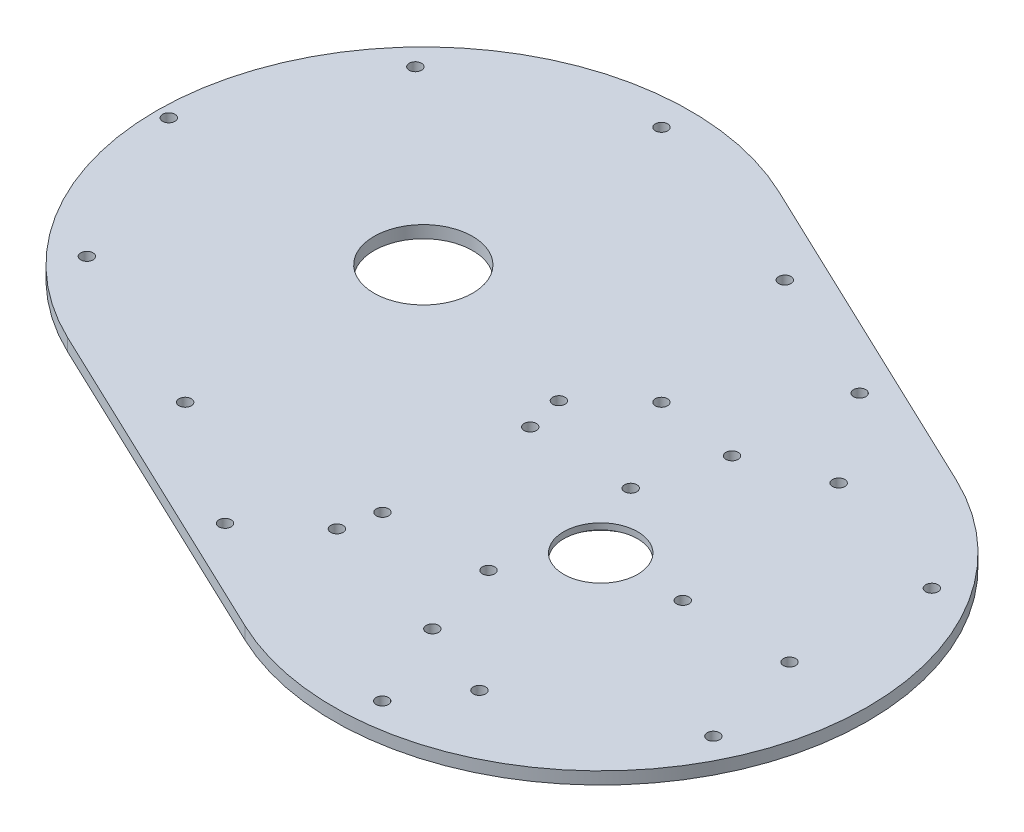
ISO-10303-21;
HEADER;
FILE_DESCRIPTION(('STEP AP214'),'2;1');
FILE_NAME('part.step','',(''),(''),'','','');
FILE_SCHEMA(('AUTOMOTIVE_DESIGN { 1 0 10303 214 1 1 1 1 }'));
ENDSEC;
DATA;
#1=APPLICATION_CONTEXT('core data for automotive mechanical design processes');
#2=APPLICATION_PROTOCOL_DEFINITION('international standard','automotive_design',2000,#1);
#3=PRODUCT_CONTEXT('',#1,'mechanical');
#4=PRODUCT('Part','Part','',(#3));
#5=PRODUCT_RELATED_PRODUCT_CATEGORY('part','',(#4));
#6=PRODUCT_DEFINITION_FORMATION('','',#4);
#7=PRODUCT_DEFINITION_CONTEXT('part definition',#1,'design');
#8=PRODUCT_DEFINITION('design','',#6,#7);
#9=PRODUCT_DEFINITION_SHAPE('','',#8);
#10=(LENGTH_UNIT() NAMED_UNIT(*) SI_UNIT(.MILLI.,.METRE.));
#11=(NAMED_UNIT(*) PLANE_ANGLE_UNIT() SI_UNIT($,.RADIAN.));
#12=(NAMED_UNIT(*) SI_UNIT($,.STERADIAN.) SOLID_ANGLE_UNIT());
#13=UNCERTAINTY_MEASURE_WITH_UNIT(LENGTH_MEASURE(1.E-05),#10,'distance_accuracy_value','');
#14=(GEOMETRIC_REPRESENTATION_CONTEXT(3) GLOBAL_UNCERTAINTY_ASSIGNED_CONTEXT((#13)) GLOBAL_UNIT_ASSIGNED_CONTEXT((#10,
#11,#12)) REPRESENTATION_CONTEXT('',''));
#15=CARTESIAN_POINT('',(0.,0.,0.));
#16=DIRECTION('',(0.,0.,1.));
#17=DIRECTION('',(1.,0.,0.));
#18=AXIS2_PLACEMENT_3D('',#15,#16,#17);
#19=CARTESIAN_POINT('',(41.2,3.,0.));
#20=DIRECTION('',(0.,-1.,0.));
#21=DIRECTION('',(0.,0.,-1.));
#22=AXIS2_PLACEMENT_3D('',#19,#20,#21);
#23=CYLINDRICAL_SURFACE('',#22,9.);
#24=CARTESIAN_POINT('',(41.2,3.,0.));
#25=DIRECTION('',(0.,1.,0.));
#26=DIRECTION('',(0.,0.,1.));
#27=AXIS2_PLACEMENT_3D('',#24,#25,#26);
#28=CIRCLE('',#27,9.);
#29=CARTESIAN_POINT('',(41.2,3.,8.99999999999999));
#30=VERTEX_POINT('',#29);
#31=EDGE_CURVE('E106',#30,#30,#28,.T.);
#32=ORIENTED_EDGE('',*,*,#31,.T.);
#33=EDGE_LOOP('',(#32));
#34=FACE_BOUND('',#33,.T.);
#35=CARTESIAN_POINT('',(41.2,1.5,0.));
#36=DIRECTION('',(0.,-1.,0.));
#37=DIRECTION('',(1.,0.,0.));
#38=AXIS2_PLACEMENT_3D('',#35,#36,#37);
#39=CIRCLE('',#38,9.);
#40=CARTESIAN_POINT('',(50.2,1.5,0.));
#41=VERTEX_POINT('',#40);
#42=EDGE_CURVE('E631',#41,#41,#39,.T.);
#43=ORIENTED_EDGE('',*,*,#42,.T.);
#44=EDGE_LOOP('',(#43));
#45=FACE_BOUND('',#44,.T.);
#46=ADVANCED_FACE('F40',(#34,#45),#23,.F.);
#47=CARTESIAN_POINT('',(0.,3.,0.));
#48=DIRECTION('',(0.,1.,0.));
#49=DIRECTION('',(0.,0.,1.));
#50=AXIS2_PLACEMENT_3D('',#47,#48,#49);
#51=PLANE('',#50);
#52=CARTESIAN_POINT('',(45.8095496501731,3.,57.818289078998));
#53=DIRECTION('',(0.,1.,0.));
#54=DIRECTION('',(0.,0.,1.));
#55=AXIS2_PLACEMENT_3D('',#52,#53,#54);
#56=CIRCLE('',#55,1.50000000000003);
#57=CARTESIAN_POINT('',(45.8095496501731,3.,59.318289078998));
#58=VERTEX_POINT('',#57);
#59=EDGE_CURVE('E262',#58,#58,#56,.F.);
#60=ORIENTED_EDGE('',*,*,#59,.T.);
#61=EDGE_LOOP('',(#60));
#62=FACE_BOUND('',#61,.T.);
#63=CARTESIAN_POINT('',(93.5768819708512,3.,24.9171574424437));
#64=DIRECTION('',(0.,1.,0.));
#65=DIRECTION('',(0.,0.,1.));
#66=AXIS2_PLACEMENT_3D('',#63,#64,#65);
#67=CIRCLE('',#66,1.5);
#68=CARTESIAN_POINT('',(93.5768819708512,3.,26.4171574424437));
#69=VERTEX_POINT('',#68);
#70=EDGE_CURVE('E268',#69,#69,#67,.T.);
#71=ORIENTED_EDGE('',*,*,#70,.F.);
#72=EDGE_LOOP('',(#71));
#73=FACE_BOUND('',#72,.T.);
#74=CARTESIAN_POINT('',(88.9673323206785,3.,-32.9011316365542));
#75=DIRECTION('',(0.,1.,0.));
#76=DIRECTION('',(0.,0.,1.));
#77=AXIS2_PLACEMENT_3D('',#74,#75,#76);
#78=CIRCLE('',#77,1.5);
#79=CARTESIAN_POINT('',(88.9673323206785,3.,-31.4011316365542));
#80=VERTEX_POINT('',#79);
#81=EDGE_CURVE('E274',#80,#80,#78,.T.);
#82=ORIENTED_EDGE('',*,*,#81,.F.);
#83=EDGE_LOOP('',(#82));
#84=FACE_BOUND('',#83,.T.);
#85=CARTESIAN_POINT('',(39.0264821333822,3.,-65.2646789625407));
#86=DIRECTION('',(0.,1.,0.));
#87=DIRECTION('',(0.,0.,1.));
#88=AXIS2_PLACEMENT_3D('',#85,#86,#87);
#89=CIRCLE('',#88,1.5);
#90=CARTESIAN_POINT('',(39.0264821333822,3.,-63.7646789625406));
#91=VERTEX_POINT('',#90);
#92=EDGE_CURVE('E280',#91,#91,#89,.T.);
#93=ORIENTED_EDGE('',*,*,#92,.F.);
#94=EDGE_LOOP('',(#93));
#95=FACE_BOUND('',#94,.T.);
#96=CARTESIAN_POINT('',(-103.2,3.,-39.2));
#97=DIRECTION('',(0.,1.,0.));
#98=DIRECTION('',(0.,0.,1.));
#99=AXIS2_PLACEMENT_3D('',#96,#97,#98);
#100=CIRCLE('',#99,1.5);
#101=CARTESIAN_POINT('',(-103.2,3.,-37.7));
#102=VERTEX_POINT('',#101);
#103=EDGE_CURVE('E211',#102,#102,#100,.T.);
#104=ORIENTED_EDGE('',*,*,#103,.F.);
#105=EDGE_LOOP('',(#104));
#106=FACE_BOUND('',#105,.T.);
#107=CARTESIAN_POINT('',(36.7,3.,-36.5));
#108=DIRECTION('',(0.,1.,0.));
#109=DIRECTION('',(0.,0.,1.));
#110=AXIS2_PLACEMENT_3D('',#107,#108,#109);
#111=CIRCLE('',#110,1.5);
#112=CARTESIAN_POINT('',(36.7,3.,-35.));
#113=VERTEX_POINT('',#112);
#114=EDGE_CURVE('E286',#113,#113,#111,.F.);
#115=ORIENTED_EDGE('',*,*,#114,.T.);
#116=EDGE_LOOP('',(#115));
#117=FACE_BOUND('',#116,.T.);
#118=CARTESIAN_POINT('',(36.7,3.,36.5));
#119=DIRECTION('',(0.,1.,0.));
#120=DIRECTION('',(0.,0.,1.));
#121=AXIS2_PLACEMENT_3D('',#118,#119,#120);
#122=CIRCLE('',#121,1.5);
#123=CARTESIAN_POINT('',(36.7,3.,38.));
#124=VERTEX_POINT('',#123);
#125=EDGE_CURVE('E289',#124,#124,#122,.T.);
#126=ORIENTED_EDGE('',*,*,#125,.F.);
#127=EDGE_LOOP('',(#126));
#128=FACE_BOUND('',#127,.T.);
#129=CARTESIAN_POINT('',(31.2,3.,-17.3205080756888));
#130=DIRECTION('',(0.,1.,0.));
#131=DIRECTION('',(0.,0.,1.));
#132=AXIS2_PLACEMENT_3D('',#129,#130,#131);
#133=CIRCLE('',#132,1.49999999999916);
#134=CARTESIAN_POINT('',(31.2,3.,-15.8205080756896));
#135=VERTEX_POINT('',#134);
#136=EDGE_CURVE('E292',#135,#135,#133,.T.);
#137=ORIENTED_EDGE('',*,*,#136,.F.);
#138=EDGE_LOOP('',(#137));
#139=FACE_BOUND('',#138,.T.);
#140=CARTESIAN_POINT('',(31.2,3.,17.3205080756887));
#141=DIRECTION('',(0.,1.,0.));
#142=DIRECTION('',(0.,0.,1.));
#143=AXIS2_PLACEMENT_3D('',#140,#141,#142);
#144=CIRCLE('',#143,1.50000000000258);
#145=CARTESIAN_POINT('',(31.2,3.,18.8205080756913));
#146=VERTEX_POINT('',#145);
#147=EDGE_CURVE('E295',#146,#146,#144,.T.);
#148=ORIENTED_EDGE('',*,*,#147,.F.);
#149=EDGE_LOOP('',(#148));
#150=FACE_BOUND('',#149,.T.);
#151=CARTESIAN_POINT('',(61.2,3.,0.));
#152=DIRECTION('',(0.,1.,0.));
#153=DIRECTION('',(0.,0.,1.));
#154=AXIS2_PLACEMENT_3D('',#151,#152,#153);
#155=CIRCLE('',#154,1.50000000000001);
#156=CARTESIAN_POINT('',(61.2,3.,1.50000000000001));
#157=VERTEX_POINT('',#156);
#158=EDGE_CURVE('E298',#157,#157,#155,.T.);
#159=ORIENTED_EDGE('',*,*,#158,.F.);
#160=EDGE_LOOP('',(#159));
#161=FACE_BOUND('',#160,.T.);
#162=CARTESIAN_POINT('',(3.98521825875239,3.,-27.0381216054538));
#163=DIRECTION('',(0.,1.,0.));
#164=DIRECTION('',(0.,0.,1.));
#165=AXIS2_PLACEMENT_3D('',#162,#163,#164);
#166=CIRCLE('',#165,1.49999999999998);
#167=CARTESIAN_POINT('',(3.98521825875239,3.,-25.5381216054538));
#168=VERTEX_POINT('',#167);
#169=EDGE_CURVE('E301',#168,#168,#166,.F.);
#170=ORIENTED_EDGE('',*,*,#169,.T.);
#171=EDGE_LOOP('',(#170));
#172=FACE_BOUND('',#171,.T.);
#173=CARTESIAN_POINT('',(55.4147817412476,3.,43.7485997495771));
#174=DIRECTION('',(0.,1.,0.));
#175=DIRECTION('',(0.,0.,1.));
#176=AXIS2_PLACEMENT_3D('',#173,#174,#175);
#177=CIRCLE('',#176,1.49999999999999);
#178=CARTESIAN_POINT('',(55.4147817412476,3.,45.2485997495771));
#179=VERTEX_POINT('',#178);
#180=EDGE_CURVE('E304',#179,#179,#177,.F.);
#181=ORIENTED_EDGE('',*,*,#180,.T.);
#182=EDGE_LOOP('',(#181));
#183=FACE_BOUND('',#182,.T.);
#184=DIRECTION('',(0.903022510302053,0.,0.429593233056316));
#185=VECTOR('',#184,1.);
#186=CARTESIAN_POINT('',(-20.3200858980841,3.,42.7136499490339));
#187=LINE('',#186,#185);
#188=CARTESIAN_POINT('',(-69.1235601486605,3.,19.4964631696334));
#189=VERTEX_POINT('',#188);
#190=CARTESIAN_POINT('',(13.2764398513395,3.,58.6964631696334));
#191=VERTEX_POINT('',#190);
#192=EDGE_CURVE('E89',#189,#191,#187,.T.);
#193=ORIENTED_EDGE('',*,*,#192,.T.);
#194=CARTESIAN_POINT('',(41.2,3.,0.));
#195=DIRECTION('',(0.,1.,0.));
#196=DIRECTION('',(0.,0.,1.));
#197=AXIS2_PLACEMENT_3D('',#194,#195,#196);
#198=CIRCLE('',#197,65.);
#199=CARTESIAN_POINT('',(69.1235601486606,3.,-58.6964631696335));
#200=VERTEX_POINT('',#199);
#201=EDGE_CURVE('E83',#191,#200,#198,.T.);
#202=ORIENTED_EDGE('',*,*,#201,.T.);
#203=DIRECTION('',(0.903022510302053,0.,0.429593233056317));
#204=VECTOR('',#203,1.);
#205=CARTESIAN_POINT('',(35.5270343992371,3.,-74.679276390233));
#206=LINE('',#205,#204);
#207=CARTESIAN_POINT('',(-13.2764398513394,3.,-97.8964631696335));
#208=VERTEX_POINT('',#207);
#209=EDGE_CURVE('E87',#208,#200,#206,.T.);
#210=ORIENTED_EDGE('',*,*,#209,.F.);
#211=CARTESIAN_POINT('',(-41.2,3.,-39.2));
#212=DIRECTION('',(0.,1.,0.));
#213=DIRECTION('',(0.,0.,1.));
#214=AXIS2_PLACEMENT_3D('',#211,#212,#213);
#215=CIRCLE('',#214,65.);
#216=EDGE_CURVE('E57',#208,#189,#215,.T.);
#217=ORIENTED_EDGE('',*,*,#216,.T.);
#218=EDGE_LOOP('',(#193,#202,#210,#217));
#219=FACE_BOUND('',#218,.T.);
#220=CARTESIAN_POINT('',(-41.2,3.,-39.2));
#221=DIRECTION('',(0.,1.,0.));
#222=DIRECTION('',(0.,0.,1.));
#223=AXIS2_PLACEMENT_3D('',#220,#221,#222);
#224=CIRCLE('',#223,12.);
#225=CARTESIAN_POINT('',(-41.2,3.,-27.2));
#226=VERTEX_POINT('',#225);
#227=EDGE_CURVE('E100',#226,#226,#224,.T.);
#228=ORIENTED_EDGE('',*,*,#227,.F.);
#229=EDGE_LOOP('',(#228));
#230=FACE_BOUND('',#229,.T.);
#231=ORIENTED_EDGE('',*,*,#31,.F.);
#232=EDGE_LOOP('',(#231));
#233=FACE_BOUND('',#232,.T.);
#234=CARTESIAN_POINT('',(87.2,3.,0.));
#235=DIRECTION('',(0.,1.,0.));
#236=DIRECTION('',(0.,0.,1.));
#237=AXIS2_PLACEMENT_3D('',#234,#235,#236);
#238=CIRCLE('',#237,1.5);
#239=CARTESIAN_POINT('',(87.2,3.,1.49999999999998));
#240=VERTEX_POINT('',#239);
#241=EDGE_CURVE('E109',#240,#240,#238,.F.);
#242=ORIENTED_EDGE('',*,*,#241,.T.);
#243=EDGE_LOOP('',(#242));
#244=FACE_BOUND('',#243,.T.);
#245=CARTESIAN_POINT('',(3.98521825875244,3.,27.0381216054538));
#246=DIRECTION('',(0.,1.,0.));
#247=DIRECTION('',(0.,0.,1.));
#248=AXIS2_PLACEMENT_3D('',#245,#246,#247);
#249=CIRCLE('',#248,1.49999999999996);
#250=CARTESIAN_POINT('',(3.98521825875244,3.,28.5381216054537));
#251=VERTEX_POINT('',#250);
#252=EDGE_CURVE('E112',#251,#251,#249,.F.);
#253=ORIENTED_EDGE('',*,*,#252,.T.);
#254=EDGE_LOOP('',(#253));
#255=FACE_BOUND('',#254,.T.);
#256=CARTESIAN_POINT('',(55.4147817412476,3.,-43.7485997495771));
#257=DIRECTION('',(0.,1.,0.));
#258=DIRECTION('',(0.,0.,1.));
#259=AXIS2_PLACEMENT_3D('',#256,#257,#258);
#260=CIRCLE('',#259,1.49999999999999);
#261=CARTESIAN_POINT('',(55.4147817412476,3.,-42.2485997495771));
#262=VERTEX_POINT('',#261);
#263=EDGE_CURVE('E115',#262,#262,#260,.F.);
#264=ORIENTED_EDGE('',*,*,#263,.T.);
#265=EDGE_LOOP('',(#264));
#266=FACE_BOUND('',#265,.T.);
#267=CARTESIAN_POINT('',(-83.95,3.,0.));
#268=DIRECTION('',(0.,1.,0.));
#269=DIRECTION('',(0.,0.,1.));
#270=AXIS2_PLACEMENT_3D('',#267,#268,#269);
#271=CIRCLE('',#270,1.5);
#272=CARTESIAN_POINT('',(-83.95,3.,1.5));
#273=VERTEX_POINT('',#272);
#274=EDGE_CURVE('E118',#273,#273,#271,.T.);
#275=ORIENTED_EDGE('',*,*,#274,.F.);
#276=EDGE_LOOP('',(#275));
#277=FACE_BOUND('',#276,.T.);
#278=CARTESIAN_POINT('',(-41.1999999999998,3.,-97.201745663385));
#279=DIRECTION('',(0.,1.,0.));
#280=DIRECTION('',(0.,0.,1.));
#281=AXIS2_PLACEMENT_3D('',#278,#279,#280);
#282=CIRCLE('',#281,1.5);
#283=CARTESIAN_POINT('',(-41.1999999999998,3.,-95.701745663385));
#284=VERTEX_POINT('',#283);
#285=EDGE_CURVE('E121',#284,#284,#282,.T.);
#286=ORIENTED_EDGE('',*,*,#285,.F.);
#287=EDGE_LOOP('',(#286));
#288=FACE_BOUND('',#287,.T.);
#289=CARTESIAN_POINT('',(16.801745663385,3.,-39.1999999999996));
#290=DIRECTION('',(0.,1.,0.));
#291=DIRECTION('',(0.,0.,1.));
#292=AXIS2_PLACEMENT_3D('',#289,#290,#291);
#293=CIRCLE('',#292,1.49999999999999);
#294=CARTESIAN_POINT('',(16.801745663385,3.,-37.6999999999996));
#295=VERTEX_POINT('',#294);
#296=EDGE_CURVE('E124',#295,#295,#293,.T.);
#297=ORIENTED_EDGE('',*,*,#296,.F.);
#298=EDGE_LOOP('',(#297));
#299=FACE_BOUND('',#298,.T.);
#300=CARTESIAN_POINT('',(-41.2000000000006,3.,18.801745663385));
#301=DIRECTION('',(0.,1.,0.));
#302=DIRECTION('',(0.,0.,1.));
#303=AXIS2_PLACEMENT_3D('',#300,#301,#302);
#304=CIRCLE('',#303,1.49999999999999);
#305=CARTESIAN_POINT('',(-41.2000000000006,3.,20.301745663385));
#306=VERTEX_POINT('',#305);
#307=EDGE_CURVE('E127',#306,#306,#304,.T.);
#308=ORIENTED_EDGE('',*,*,#307,.F.);
#309=EDGE_LOOP('',(#308));
#310=FACE_BOUND('',#309,.T.);
#311=CARTESIAN_POINT('',(-83.95,3.,-80.));
#312=DIRECTION('',(0.,1.,0.));
#313=DIRECTION('',(0.,0.,1.));
#314=AXIS2_PLACEMENT_3D('',#311,#312,#313);
#315=CIRCLE('',#314,1.5);
#316=CARTESIAN_POINT('',(-83.95,3.,-78.5));
#317=VERTEX_POINT('',#316);
#318=EDGE_CURVE('E130',#317,#317,#315,.T.);
#319=ORIENTED_EDGE('',*,*,#318,.F.);
#320=EDGE_LOOP('',(#319));
#321=FACE_BOUND('',#320,.T.);
#322=CARTESIAN_POINT('',(6.04999999999997,3.,-80.));
#323=DIRECTION('',(0.,1.,0.));
#324=DIRECTION('',(0.,0.,1.));
#325=AXIS2_PLACEMENT_3D('',#322,#323,#324);
#326=CIRCLE('',#325,1.5);
#327=CARTESIAN_POINT('',(6.04999999999997,3.,-78.5));
#328=VERTEX_POINT('',#327);
#329=EDGE_CURVE('E133',#328,#328,#326,.T.);
#330=ORIENTED_EDGE('',*,*,#329,.F.);
#331=EDGE_LOOP('',(#330));
#332=FACE_BOUND('',#331,.T.);
#333=CARTESIAN_POINT('',(6.04999999999997,3.,-18.));
#334=DIRECTION('',(0.,1.,0.));
#335=DIRECTION('',(0.,0.,1.));
#336=AXIS2_PLACEMENT_3D('',#333,#334,#335);
#337=CIRCLE('',#336,1.5);
#338=CARTESIAN_POINT('',(6.04999999999997,3.,-16.5));
#339=VERTEX_POINT('',#338);
#340=EDGE_CURVE('E136',#339,#339,#337,.T.);
#341=ORIENTED_EDGE('',*,*,#340,.F.);
#342=EDGE_LOOP('',(#341));
#343=FACE_BOUND('',#342,.T.);
#344=CARTESIAN_POINT('',(6.04999999999997,3.,18.));
#345=DIRECTION('',(0.,1.,0.));
#346=DIRECTION('',(0.,0.,1.));
#347=AXIS2_PLACEMENT_3D('',#344,#345,#346);
#348=CIRCLE('',#347,1.5);
#349=CARTESIAN_POINT('',(6.04999999999997,3.,19.5));
#350=VERTEX_POINT('',#349);
#351=EDGE_CURVE('E139',#350,#350,#348,.F.);
#352=ORIENTED_EDGE('',*,*,#351,.T.);
#353=EDGE_LOOP('',(#352));
#354=FACE_BOUND('',#353,.T.);
#355=CARTESIAN_POINT('',(-10.8078327515053,3.,39.4890849791616));
#356=DIRECTION('',(0.,1.,0.));
#357=DIRECTION('',(0.,0.,1.));
#358=AXIS2_PLACEMENT_3D('',#355,#356,#357);
#359=CIRCLE('',#358,1.49999999999998);
#360=CARTESIAN_POINT('',(-10.8078327515053,3.,40.9890849791616));
#361=VERTEX_POINT('',#360);
#362=EDGE_CURVE('E253',#361,#361,#359,.F.);
#363=ORIENTED_EDGE('',*,*,#362,.T.);
#364=EDGE_LOOP('',(#363));
#365=FACE_BOUND('',#364,.T.);
#366=ADVANCED_FACE('F84',(#62,#73,#84,#95,#106,#117,#128,#139,#150,#161,#172,#183,#219,#230,
#233,#244,#255,#266,#277,#288,#299,#310,#321,#332,#343,#354,#365),#51,.T.);
#367=CARTESIAN_POINT('',(0.,0.,0.));
#368=DIRECTION('',(0.,1.,0.));
#369=DIRECTION('',(0.,0.,1.));
#370=AXIS2_PLACEMENT_3D('',#367,#368,#369);
#371=PLANE('',#370);
#372=CARTESIAN_POINT('',(41.2,0.,0.));
#373=DIRECTION('',(0.,-1.,0.));
#374=DIRECTION('',(1.,0.,0.));
#375=AXIS2_PLACEMENT_3D('',#372,#373,#374);
#376=CIRCLE('',#375,11.);
#377=CARTESIAN_POINT('',(52.2,0.,0.));
#378=VERTEX_POINT('',#377);
#379=EDGE_CURVE('E258',#378,#378,#376,.T.);
#380=ORIENTED_EDGE('',*,*,#379,.F.);
#381=EDGE_LOOP('',(#380));
#382=FACE_BOUND('',#381,.T.);
#383=CARTESIAN_POINT('',(93.5768819708512,0.,24.9171574424437));
#384=DIRECTION('',(0.,1.,0.));
#385=DIRECTION('',(0.,0.,1.));
#386=AXIS2_PLACEMENT_3D('',#383,#384,#385);
#387=CIRCLE('',#386,1.5);
#388=CARTESIAN_POINT('',(93.5768819708512,0.,26.4171574424437));
#389=VERTEX_POINT('',#388);
#390=EDGE_CURVE('E265',#389,#389,#387,.T.);
#391=ORIENTED_EDGE('',*,*,#390,.T.);
#392=EDGE_LOOP('',(#391));
#393=FACE_BOUND('',#392,.T.);
#394=CARTESIAN_POINT('',(88.9673323206785,0.,-32.9011316365542));
#395=DIRECTION('',(0.,1.,0.));
#396=DIRECTION('',(0.,0.,1.));
#397=AXIS2_PLACEMENT_3D('',#394,#395,#396);
#398=CIRCLE('',#397,1.5);
#399=CARTESIAN_POINT('',(88.9673323206785,0.,-31.4011316365542));
#400=VERTEX_POINT('',#399);
#401=EDGE_CURVE('E271',#400,#400,#398,.T.);
#402=ORIENTED_EDGE('',*,*,#401,.T.);
#403=EDGE_LOOP('',(#402));
#404=FACE_BOUND('',#403,.T.);
#405=CARTESIAN_POINT('',(39.0264821333822,0.,-65.2646789625407));
#406=DIRECTION('',(0.,1.,0.));
#407=DIRECTION('',(0.,0.,1.));
#408=AXIS2_PLACEMENT_3D('',#405,#406,#407);
#409=CIRCLE('',#408,1.5);
#410=CARTESIAN_POINT('',(39.0264821333822,0.,-63.7646789625406));
#411=VERTEX_POINT('',#410);
#412=EDGE_CURVE('E277',#411,#411,#409,.T.);
#413=ORIENTED_EDGE('',*,*,#412,.T.);
#414=EDGE_LOOP('',(#413));
#415=FACE_BOUND('',#414,.T.);
#416=CARTESIAN_POINT('',(-103.2,0.,-39.2));
#417=DIRECTION('',(0.,1.,0.));
#418=DIRECTION('',(0.,0.,1.));
#419=AXIS2_PLACEMENT_3D('',#416,#417,#418);
#420=CIRCLE('',#419,1.5);
#421=CARTESIAN_POINT('',(-103.2,0.,-37.7));
#422=VERTEX_POINT('',#421);
#423=EDGE_CURVE('E143',#422,#422,#420,.T.);
#424=ORIENTED_EDGE('',*,*,#423,.T.);
#425=EDGE_LOOP('',(#424));
#426=FACE_BOUND('',#425,.T.);
#427=CARTESIAN_POINT('',(36.7,0.,-36.5));
#428=DIRECTION('',(0.,1.,0.));
#429=DIRECTION('',(0.,0.,1.));
#430=AXIS2_PLACEMENT_3D('',#427,#428,#429);
#431=CIRCLE('',#430,1.5);
#432=CARTESIAN_POINT('',(36.7,0.,-35.));
#433=VERTEX_POINT('',#432);
#434=EDGE_CURVE('E146',#433,#433,#431,.F.);
#435=ORIENTED_EDGE('',*,*,#434,.F.);
#436=EDGE_LOOP('',(#435));
#437=FACE_BOUND('',#436,.T.);
#438=CARTESIAN_POINT('',(36.7,0.,36.5));
#439=DIRECTION('',(0.,1.,0.));
#440=DIRECTION('',(0.,0.,1.));
#441=AXIS2_PLACEMENT_3D('',#438,#439,#440);
#442=CIRCLE('',#441,1.5);
#443=CARTESIAN_POINT('',(36.7,0.,38.));
#444=VERTEX_POINT('',#443);
#445=EDGE_CURVE('E150',#444,#444,#442,.T.);
#446=ORIENTED_EDGE('',*,*,#445,.T.);
#447=EDGE_LOOP('',(#446));
#448=FACE_BOUND('',#447,.T.);
#449=CARTESIAN_POINT('',(31.2,0.,-17.3205080756888));
#450=DIRECTION('',(0.,1.,0.));
#451=DIRECTION('',(0.,0.,1.));
#452=AXIS2_PLACEMENT_3D('',#449,#450,#451);
#453=CIRCLE('',#452,1.49999999999916);
#454=CARTESIAN_POINT('',(31.2,0.,-15.8205080756896));
#455=VERTEX_POINT('',#454);
#456=EDGE_CURVE('E153',#455,#455,#453,.T.);
#457=ORIENTED_EDGE('',*,*,#456,.T.);
#458=EDGE_LOOP('',(#457));
#459=FACE_BOUND('',#458,.T.);
#460=CARTESIAN_POINT('',(31.2,0.,17.3205080756887));
#461=DIRECTION('',(0.,1.,0.));
#462=DIRECTION('',(0.,0.,1.));
#463=AXIS2_PLACEMENT_3D('',#460,#461,#462);
#464=CIRCLE('',#463,1.50000000000258);
#465=CARTESIAN_POINT('',(31.2,0.,18.8205080756913));
#466=VERTEX_POINT('',#465);
#467=EDGE_CURVE('E156',#466,#466,#464,.T.);
#468=ORIENTED_EDGE('',*,*,#467,.T.);
#469=EDGE_LOOP('',(#468));
#470=FACE_BOUND('',#469,.T.);
#471=CARTESIAN_POINT('',(61.2,0.,0.));
#472=DIRECTION('',(0.,1.,0.));
#473=DIRECTION('',(0.,0.,1.));
#474=AXIS2_PLACEMENT_3D('',#471,#472,#473);
#475=CIRCLE('',#474,1.50000000000001);
#476=CARTESIAN_POINT('',(61.2,0.,1.50000000000001));
#477=VERTEX_POINT('',#476);
#478=EDGE_CURVE('E159',#477,#477,#475,.T.);
#479=ORIENTED_EDGE('',*,*,#478,.T.);
#480=EDGE_LOOP('',(#479));
#481=FACE_BOUND('',#480,.T.);
#482=CARTESIAN_POINT('',(3.98521825875239,0.,-27.0381216054538));
#483=DIRECTION('',(0.,1.,0.));
#484=DIRECTION('',(0.,0.,1.));
#485=AXIS2_PLACEMENT_3D('',#482,#483,#484);
#486=CIRCLE('',#485,1.49999999999998);
#487=CARTESIAN_POINT('',(3.98521825875239,0.,-25.5381216054538));
#488=VERTEX_POINT('',#487);
#489=EDGE_CURVE('E162',#488,#488,#486,.F.);
#490=ORIENTED_EDGE('',*,*,#489,.F.);
#491=EDGE_LOOP('',(#490));
#492=FACE_BOUND('',#491,.T.);
#493=CARTESIAN_POINT('',(55.4147817412476,0.,43.7485997495771));
#494=DIRECTION('',(0.,1.,0.));
#495=DIRECTION('',(0.,0.,1.));
#496=AXIS2_PLACEMENT_3D('',#493,#494,#495);
#497=CIRCLE('',#496,1.49999999999999);
#498=CARTESIAN_POINT('',(55.4147817412476,0.,45.2485997495771));
#499=VERTEX_POINT('',#498);
#500=EDGE_CURVE('E165',#499,#499,#497,.F.);
#501=ORIENTED_EDGE('',*,*,#500,.F.);
#502=EDGE_LOOP('',(#501));
#503=FACE_BOUND('',#502,.T.);
#504=DIRECTION('',(0.903022510302053,0.,0.429593233056316));
#505=VECTOR('',#504,1.);
#506=CARTESIAN_POINT('',(-20.3200858980841,0.,42.7136499490339));
#507=LINE('',#506,#505);
#508=CARTESIAN_POINT('',(-69.1235601486605,0.,19.4964631696334));
#509=VERTEX_POINT('',#508);
#510=CARTESIAN_POINT('',(13.2764398513395,0.,58.6964631696334));
#511=VERTEX_POINT('',#510);
#512=EDGE_CURVE('E168',#509,#511,#507,.T.);
#513=ORIENTED_EDGE('',*,*,#512,.F.);
#514=CARTESIAN_POINT('',(-41.2,0.,-39.2));
#515=DIRECTION('',(0.,1.,0.));
#516=DIRECTION('',(0.,0.,1.));
#517=AXIS2_PLACEMENT_3D('',#514,#515,#516);
#518=CIRCLE('',#517,65.);
#519=CARTESIAN_POINT('',(-13.2764398513394,0.,-97.8964631696335));
#520=VERTEX_POINT('',#519);
#521=EDGE_CURVE('E76',#520,#509,#518,.T.);
#522=ORIENTED_EDGE('',*,*,#521,.F.);
#523=DIRECTION('',(0.903022510302053,0.,0.429593233056317));
#524=VECTOR('',#523,1.);
#525=CARTESIAN_POINT('',(35.5270343992371,0.,-74.679276390233));
#526=LINE('',#525,#524);
#527=CARTESIAN_POINT('',(69.1235601486606,0.,-58.6964631696335));
#528=VERTEX_POINT('',#527);
#529=EDGE_CURVE('E172',#520,#528,#526,.T.);
#530=ORIENTED_EDGE('',*,*,#529,.T.);
#531=CARTESIAN_POINT('',(41.2,0.,0.));
#532=DIRECTION('',(0.,1.,0.));
#533=DIRECTION('',(0.,0.,1.));
#534=AXIS2_PLACEMENT_3D('',#531,#532,#533);
#535=CIRCLE('',#534,65.);
#536=EDGE_CURVE('E94',#511,#528,#535,.T.);
#537=ORIENTED_EDGE('',*,*,#536,.F.);
#538=EDGE_LOOP('',(#513,#522,#530,#537));
#539=FACE_BOUND('',#538,.T.);
#540=CARTESIAN_POINT('',(-41.2,0.,-39.2));
#541=DIRECTION('',(0.,1.,0.));
#542=DIRECTION('',(0.,0.,1.));
#543=AXIS2_PLACEMENT_3D('',#540,#541,#542);
#544=CIRCLE('',#543,12.);
#545=CARTESIAN_POINT('',(-41.2,0.,-27.2));
#546=VERTEX_POINT('',#545);
#547=EDGE_CURVE('E175',#546,#546,#544,.T.);
#548=ORIENTED_EDGE('',*,*,#547,.T.);
#549=EDGE_LOOP('',(#548));
#550=FACE_BOUND('',#549,.T.);
#551=CARTESIAN_POINT('',(87.2,0.,0.));
#552=DIRECTION('',(0.,1.,0.));
#553=DIRECTION('',(0.,0.,1.));
#554=AXIS2_PLACEMENT_3D('',#551,#552,#553);
#555=CIRCLE('',#554,1.5);
#556=CARTESIAN_POINT('',(87.2,0.,1.49999999999998));
#557=VERTEX_POINT('',#556);
#558=EDGE_CURVE('E178',#557,#557,#555,.F.);
#559=ORIENTED_EDGE('',*,*,#558,.F.);
#560=EDGE_LOOP('',(#559));
#561=FACE_BOUND('',#560,.T.);
#562=CARTESIAN_POINT('',(3.98521825875244,0.,27.0381216054538));
#563=DIRECTION('',(0.,1.,0.));
#564=DIRECTION('',(0.,0.,1.));
#565=AXIS2_PLACEMENT_3D('',#562,#563,#564);
#566=CIRCLE('',#565,1.49999999999996);
#567=CARTESIAN_POINT('',(3.98521825875244,0.,28.5381216054537));
#568=VERTEX_POINT('',#567);
#569=EDGE_CURVE('E181',#568,#568,#566,.F.);
#570=ORIENTED_EDGE('',*,*,#569,.F.);
#571=EDGE_LOOP('',(#570));
#572=FACE_BOUND('',#571,.T.);
#573=CARTESIAN_POINT('',(55.4147817412476,0.,-43.7485997495771));
#574=DIRECTION('',(0.,1.,0.));
#575=DIRECTION('',(0.,0.,1.));
#576=AXIS2_PLACEMENT_3D('',#573,#574,#575);
#577=CIRCLE('',#576,1.49999999999999);
#578=CARTESIAN_POINT('',(55.4147817412476,0.,-42.2485997495771));
#579=VERTEX_POINT('',#578);
#580=EDGE_CURVE('E184',#579,#579,#577,.F.);
#581=ORIENTED_EDGE('',*,*,#580,.F.);
#582=EDGE_LOOP('',(#581));
#583=FACE_BOUND('',#582,.T.);
#584=CARTESIAN_POINT('',(-83.95,0.,0.));
#585=DIRECTION('',(0.,1.,0.));
#586=DIRECTION('',(0.,0.,1.));
#587=AXIS2_PLACEMENT_3D('',#584,#585,#586);
#588=CIRCLE('',#587,1.5);
#589=CARTESIAN_POINT('',(-83.95,0.,1.5));
#590=VERTEX_POINT('',#589);
#591=EDGE_CURVE('E187',#590,#590,#588,.T.);
#592=ORIENTED_EDGE('',*,*,#591,.T.);
#593=EDGE_LOOP('',(#592));
#594=FACE_BOUND('',#593,.T.);
#595=CARTESIAN_POINT('',(-41.1999999999998,0.,-97.201745663385));
#596=DIRECTION('',(0.,1.,0.));
#597=DIRECTION('',(0.,0.,1.));
#598=AXIS2_PLACEMENT_3D('',#595,#596,#597);
#599=CIRCLE('',#598,1.5);
#600=CARTESIAN_POINT('',(-41.1999999999998,0.,-95.701745663385));
#601=VERTEX_POINT('',#600);
#602=EDGE_CURVE('E190',#601,#601,#599,.T.);
#603=ORIENTED_EDGE('',*,*,#602,.T.);
#604=EDGE_LOOP('',(#603));
#605=FACE_BOUND('',#604,.T.);
#606=CARTESIAN_POINT('',(16.801745663385,0.,-39.1999999999996));
#607=DIRECTION('',(0.,1.,0.));
#608=DIRECTION('',(0.,0.,1.));
#609=AXIS2_PLACEMENT_3D('',#606,#607,#608);
#610=CIRCLE('',#609,1.49999999999999);
#611=CARTESIAN_POINT('',(16.801745663385,0.,-37.6999999999996));
#612=VERTEX_POINT('',#611);
#613=EDGE_CURVE('E193',#612,#612,#610,.T.);
#614=ORIENTED_EDGE('',*,*,#613,.T.);
#615=EDGE_LOOP('',(#614));
#616=FACE_BOUND('',#615,.T.);
#617=CARTESIAN_POINT('',(-41.2000000000006,0.,18.801745663385));
#618=DIRECTION('',(0.,1.,0.));
#619=DIRECTION('',(0.,0.,1.));
#620=AXIS2_PLACEMENT_3D('',#617,#618,#619);
#621=CIRCLE('',#620,1.49999999999999);
#622=CARTESIAN_POINT('',(-41.2000000000006,0.,20.301745663385));
#623=VERTEX_POINT('',#622);
#624=EDGE_CURVE('E196',#623,#623,#621,.T.);
#625=ORIENTED_EDGE('',*,*,#624,.T.);
#626=EDGE_LOOP('',(#625));
#627=FACE_BOUND('',#626,.T.);
#628=CARTESIAN_POINT('',(-83.95,0.,-80.));
#629=DIRECTION('',(0.,1.,0.));
#630=DIRECTION('',(0.,0.,1.));
#631=AXIS2_PLACEMENT_3D('',#628,#629,#630);
#632=CIRCLE('',#631,1.5);
#633=CARTESIAN_POINT('',(-83.95,0.,-78.5));
#634=VERTEX_POINT('',#633);
#635=EDGE_CURVE('E199',#634,#634,#632,.T.);
#636=ORIENTED_EDGE('',*,*,#635,.T.);
#637=EDGE_LOOP('',(#636));
#638=FACE_BOUND('',#637,.T.);
#639=CARTESIAN_POINT('',(6.04999999999997,0.,-80.));
#640=DIRECTION('',(0.,1.,0.));
#641=DIRECTION('',(0.,0.,1.));
#642=AXIS2_PLACEMENT_3D('',#639,#640,#641);
#643=CIRCLE('',#642,1.5);
#644=CARTESIAN_POINT('',(6.04999999999997,0.,-78.5));
#645=VERTEX_POINT('',#644);
#646=EDGE_CURVE('E202',#645,#645,#643,.T.);
#647=ORIENTED_EDGE('',*,*,#646,.T.);
#648=EDGE_LOOP('',(#647));
#649=FACE_BOUND('',#648,.T.);
#650=CARTESIAN_POINT('',(6.04999999999997,0.,-18.));
#651=DIRECTION('',(0.,1.,0.));
#652=DIRECTION('',(0.,0.,1.));
#653=AXIS2_PLACEMENT_3D('',#650,#651,#652);
#654=CIRCLE('',#653,1.5);
#655=CARTESIAN_POINT('',(6.04999999999997,0.,-16.5));
#656=VERTEX_POINT('',#655);
#657=EDGE_CURVE('E205',#656,#656,#654,.T.);
#658=ORIENTED_EDGE('',*,*,#657,.T.);
#659=EDGE_LOOP('',(#658));
#660=FACE_BOUND('',#659,.T.);
#661=CARTESIAN_POINT('',(6.04999999999997,0.,18.));
#662=DIRECTION('',(0.,1.,0.));
#663=DIRECTION('',(0.,0.,1.));
#664=AXIS2_PLACEMENT_3D('',#661,#662,#663);
#665=CIRCLE('',#664,1.5);
#666=CARTESIAN_POINT('',(6.04999999999997,0.,19.5));
#667=VERTEX_POINT('',#666);
#668=EDGE_CURVE('E208',#667,#667,#665,.F.);
#669=ORIENTED_EDGE('',*,*,#668,.F.);
#670=EDGE_LOOP('',(#669));
#671=FACE_BOUND('',#670,.T.);
#672=CARTESIAN_POINT('',(45.8095496501731,0.,57.818289078998));
#673=DIRECTION('',(0.,1.,0.));
#674=DIRECTION('',(0.,0.,1.));
#675=AXIS2_PLACEMENT_3D('',#672,#673,#674);
#676=CIRCLE('',#675,1.50000000000003);
#677=CARTESIAN_POINT('',(45.8095496501731,0.,59.318289078998));
#678=VERTEX_POINT('',#677);
#679=EDGE_CURVE('E249',#678,#678,#676,.F.);
#680=ORIENTED_EDGE('',*,*,#679,.F.);
#681=EDGE_LOOP('',(#680));
#682=FACE_BOUND('',#681,.T.);
#683=CARTESIAN_POINT('',(-10.8078327515053,0.,39.4890849791616));
#684=DIRECTION('',(0.,1.,0.));
#685=DIRECTION('',(0.,0.,1.));
#686=AXIS2_PLACEMENT_3D('',#683,#684,#685);
#687=CIRCLE('',#686,1.49999999999998);
#688=CARTESIAN_POINT('',(-10.8078327515053,0.,40.9890849791616));
#689=VERTEX_POINT('',#688);
#690=EDGE_CURVE('E147',#689,#689,#687,.F.);
#691=ORIENTED_EDGE('',*,*,#690,.F.);
#692=EDGE_LOOP('',(#691));
#693=FACE_BOUND('',#692,.T.);
#694=ADVANCED_FACE('F217',(#382,#393,#404,#415,#426,#437,#448,#459,#470,#481,#492,#503,#539,
#550,#561,#572,#583,#594,#605,#616,#627,#638,#649,#660,#671,#682,#693),#371,.F.);
#695=CARTESIAN_POINT('',(-20.3200858980841,3.,42.7136499490339));
#696=DIRECTION('',(0.429593233056316,0.,-0.903022510302053));
#697=DIRECTION('',(-0.903022510302053,0.,-0.429593233056316));
#698=AXIS2_PLACEMENT_3D('',#695,#696,#697);
#699=PLANE('',#698);
#700=ORIENTED_EDGE('',*,*,#512,.T.);
#701=DIRECTION('',(0.,-1.,0.));
#702=VECTOR('',#701,1.);
#703=CARTESIAN_POINT('',(13.2764398513395,3.,58.6964631696334));
#704=LINE('',#703,#702);
#705=EDGE_CURVE('E11',#191,#511,#704,.T.);
#706=ORIENTED_EDGE('',*,*,#705,.F.);
#707=ORIENTED_EDGE('',*,*,#192,.F.);
#708=DIRECTION('',(0.,-1.,0.));
#709=VECTOR('',#708,1.);
#710=CARTESIAN_POINT('',(-69.1235601486605,3.,19.4964631696334));
#711=LINE('',#710,#709);
#712=EDGE_CURVE('E142',#189,#509,#711,.T.);
#713=ORIENTED_EDGE('',*,*,#712,.T.);
#714=EDGE_LOOP('',(#700,#706,#707,#713));
#715=FACE_BOUND('',#714,.T.);
#716=ADVANCED_FACE('F215',(#715),#699,.F.);
#717=CARTESIAN_POINT('',(41.2,3.,0.));
#718=DIRECTION('',(0.,-1.,0.));
#719=DIRECTION('',(0.,0.,-1.));
#720=AXIS2_PLACEMENT_3D('',#717,#718,#719);
#721=CYLINDRICAL_SURFACE('',#720,65.);
#722=ORIENTED_EDGE('',*,*,#536,.T.);
#723=DIRECTION('',(0.,-1.,0.));
#724=VECTOR('',#723,1.);
#725=CARTESIAN_POINT('',(69.1235601486606,3.,-58.6964631696335));
#726=LINE('',#725,#724);
#727=EDGE_CURVE('E49',#200,#528,#726,.T.);
#728=ORIENTED_EDGE('',*,*,#727,.F.);
#729=ORIENTED_EDGE('',*,*,#201,.F.);
#730=ORIENTED_EDGE('',*,*,#705,.T.);
#731=EDGE_LOOP('',(#722,#728,#729,#730));
#732=FACE_BOUND('',#731,.T.);
#733=ADVANCED_FACE('F93',(#732),#721,.T.);
#734=CARTESIAN_POINT('',(35.5270343992371,3.,-74.679276390233));
#735=DIRECTION('',(0.429593233056317,0.,-0.903022510302053));
#736=DIRECTION('',(-0.903022510302053,0.,-0.429593233056317));
#737=AXIS2_PLACEMENT_3D('',#734,#735,#736);
#738=PLANE('',#737);
#739=ORIENTED_EDGE('',*,*,#529,.F.);
#740=DIRECTION('',(0.,-1.,0.));
#741=VECTOR('',#740,1.);
#742=CARTESIAN_POINT('',(-13.2764398513394,3.,-97.8964631696335));
#743=LINE('',#742,#741);
#744=EDGE_CURVE('E73',#208,#520,#743,.T.);
#745=ORIENTED_EDGE('',*,*,#744,.F.);
#746=ORIENTED_EDGE('',*,*,#209,.T.);
#747=ORIENTED_EDGE('',*,*,#727,.T.);
#748=EDGE_LOOP('',(#739,#745,#746,#747));
#749=FACE_BOUND('',#748,.T.);
#750=ADVANCED_FACE('F98',(#749),#738,.T.);
#751=CARTESIAN_POINT('',(6.04999999999997,3.,-18.));
#752=DIRECTION('',(0.,-1.,0.));
#753=DIRECTION('',(0.,0.,-1.));
#754=AXIS2_PLACEMENT_3D('',#751,#752,#753);
#755=CYLINDRICAL_SURFACE('',#754,1.5);
#756=ORIENTED_EDGE('',*,*,#340,.T.);
#757=EDGE_LOOP('',(#756));
#758=FACE_BOUND('',#757,.T.);
#759=ORIENTED_EDGE('',*,*,#657,.F.);
#760=EDGE_LOOP('',(#759));
#761=FACE_BOUND('',#760,.T.);
#762=ADVANCED_FACE('F345',(#758,#761),#755,.F.);
#763=CARTESIAN_POINT('',(6.04999999999997,3.,-80.));
#764=DIRECTION('',(0.,-1.,0.));
#765=DIRECTION('',(0.,0.,-1.));
#766=AXIS2_PLACEMENT_3D('',#763,#764,#765);
#767=CYLINDRICAL_SURFACE('',#766,1.5);
#768=ORIENTED_EDGE('',*,*,#329,.T.);
#769=EDGE_LOOP('',(#768));
#770=FACE_BOUND('',#769,.T.);
#771=ORIENTED_EDGE('',*,*,#646,.F.);
#772=EDGE_LOOP('',(#771));
#773=FACE_BOUND('',#772,.T.);
#774=ADVANCED_FACE('F366',(#770,#773),#767,.F.);
#775=CARTESIAN_POINT('',(-83.95,3.,-80.));
#776=DIRECTION('',(0.,-1.,0.));
#777=DIRECTION('',(0.,0.,-1.));
#778=AXIS2_PLACEMENT_3D('',#775,#776,#777);
#779=CYLINDRICAL_SURFACE('',#778,1.5);
#780=ORIENTED_EDGE('',*,*,#318,.T.);
#781=EDGE_LOOP('',(#780));
#782=FACE_BOUND('',#781,.T.);
#783=ORIENTED_EDGE('',*,*,#635,.F.);
#784=EDGE_LOOP('',(#783));
#785=FACE_BOUND('',#784,.T.);
#786=ADVANCED_FACE('F374',(#782,#785),#779,.F.);
#787=CARTESIAN_POINT('',(-41.2000000000006,3.,18.801745663385));
#788=DIRECTION('',(0.,-1.,0.));
#789=DIRECTION('',(0.,0.,-1.));
#790=AXIS2_PLACEMENT_3D('',#787,#788,#789);
#791=CYLINDRICAL_SURFACE('',#790,1.49999999999999);
#792=ORIENTED_EDGE('',*,*,#307,.T.);
#793=EDGE_LOOP('',(#792));
#794=FACE_BOUND('',#793,.T.);
#795=ORIENTED_EDGE('',*,*,#624,.F.);
#796=EDGE_LOOP('',(#795));
#797=FACE_BOUND('',#796,.T.);
#798=ADVANCED_FACE('F382',(#794,#797),#791,.F.);
#799=CARTESIAN_POINT('',(16.801745663385,3.,-39.1999999999996));
#800=DIRECTION('',(0.,-1.,0.));
#801=DIRECTION('',(0.,0.,-1.));
#802=AXIS2_PLACEMENT_3D('',#799,#800,#801);
#803=CYLINDRICAL_SURFACE('',#802,1.49999999999999);
#804=ORIENTED_EDGE('',*,*,#296,.T.);
#805=EDGE_LOOP('',(#804));
#806=FACE_BOUND('',#805,.T.);
#807=ORIENTED_EDGE('',*,*,#613,.F.);
#808=EDGE_LOOP('',(#807));
#809=FACE_BOUND('',#808,.T.);
#810=ADVANCED_FACE('F390',(#806,#809),#803,.F.);
#811=CARTESIAN_POINT('',(-41.1999999999998,3.,-97.201745663385));
#812=DIRECTION('',(0.,-1.,0.));
#813=DIRECTION('',(0.,0.,-1.));
#814=AXIS2_PLACEMENT_3D('',#811,#812,#813);
#815=CYLINDRICAL_SURFACE('',#814,1.5);
#816=ORIENTED_EDGE('',*,*,#285,.T.);
#817=EDGE_LOOP('',(#816));
#818=FACE_BOUND('',#817,.T.);
#819=ORIENTED_EDGE('',*,*,#602,.F.);
#820=EDGE_LOOP('',(#819));
#821=FACE_BOUND('',#820,.T.);
#822=ADVANCED_FACE('F398',(#818,#821),#815,.F.);
#823=CARTESIAN_POINT('',(-83.95,3.,0.));
#824=DIRECTION('',(0.,-1.,0.));
#825=DIRECTION('',(0.,0.,-1.));
#826=AXIS2_PLACEMENT_3D('',#823,#824,#825);
#827=CYLINDRICAL_SURFACE('',#826,1.5);
#828=ORIENTED_EDGE('',*,*,#274,.T.);
#829=EDGE_LOOP('',(#828));
#830=FACE_BOUND('',#829,.T.);
#831=ORIENTED_EDGE('',*,*,#591,.F.);
#832=EDGE_LOOP('',(#831));
#833=FACE_BOUND('',#832,.T.);
#834=ADVANCED_FACE('F406',(#830,#833),#827,.F.);
#835=CARTESIAN_POINT('',(55.4147817412476,3.,-43.7485997495771));
#836=DIRECTION('',(0.,-1.,0.));
#837=DIRECTION('',(0.,0.,-1.));
#838=AXIS2_PLACEMENT_3D('',#835,#836,#837);
#839=CYLINDRICAL_SURFACE('',#838,1.49999999999999);
#840=ORIENTED_EDGE('',*,*,#263,.F.);
#841=EDGE_LOOP('',(#840));
#842=FACE_BOUND('',#841,.T.);
#843=ORIENTED_EDGE('',*,*,#580,.T.);
#844=EDGE_LOOP('',(#843));
#845=FACE_BOUND('',#844,.T.);
#846=ADVANCED_FACE('F414',(#842,#845),#839,.F.);
#847=CARTESIAN_POINT('',(3.98521825875244,3.,27.0381216054538));
#848=DIRECTION('',(0.,-1.,0.));
#849=DIRECTION('',(0.,0.,-1.));
#850=AXIS2_PLACEMENT_3D('',#847,#848,#849);
#851=CYLINDRICAL_SURFACE('',#850,1.49999999999996);
#852=ORIENTED_EDGE('',*,*,#252,.F.);
#853=EDGE_LOOP('',(#852));
#854=FACE_BOUND('',#853,.T.);
#855=ORIENTED_EDGE('',*,*,#569,.T.);
#856=EDGE_LOOP('',(#855));
#857=FACE_BOUND('',#856,.T.);
#858=ADVANCED_FACE('F422',(#854,#857),#851,.F.);
#859=CARTESIAN_POINT('',(87.2,3.,0.));
#860=DIRECTION('',(0.,-1.,0.));
#861=DIRECTION('',(0.,0.,-1.));
#862=AXIS2_PLACEMENT_3D('',#859,#860,#861);
#863=CYLINDRICAL_SURFACE('',#862,1.5);
#864=ORIENTED_EDGE('',*,*,#241,.F.);
#865=EDGE_LOOP('',(#864));
#866=FACE_BOUND('',#865,.T.);
#867=ORIENTED_EDGE('',*,*,#558,.T.);
#868=EDGE_LOOP('',(#867));
#869=FACE_BOUND('',#868,.T.);
#870=ADVANCED_FACE('F338',(#866,#869),#863,.F.);
#871=CARTESIAN_POINT('',(-41.2,3.,-39.2));
#872=DIRECTION('',(0.,-1.,0.));
#873=DIRECTION('',(0.,0.,-1.));
#874=AXIS2_PLACEMENT_3D('',#871,#872,#873);
#875=CYLINDRICAL_SURFACE('',#874,12.);
#876=ORIENTED_EDGE('',*,*,#227,.T.);
#877=EDGE_LOOP('',(#876));
#878=FACE_BOUND('',#877,.T.);
#879=ORIENTED_EDGE('',*,*,#547,.F.);
#880=EDGE_LOOP('',(#879));
#881=FACE_BOUND('',#880,.T.);
#882=ADVANCED_FACE('F324',(#878,#881),#875,.F.);
#883=CARTESIAN_POINT('',(-41.2,3.,-39.2));
#884=DIRECTION('',(0.,-1.,0.));
#885=DIRECTION('',(0.,0.,-1.));
#886=AXIS2_PLACEMENT_3D('',#883,#884,#885);
#887=CYLINDRICAL_SURFACE('',#886,65.);
#888=ORIENTED_EDGE('',*,*,#521,.T.);
#889=ORIENTED_EDGE('',*,*,#712,.F.);
#890=ORIENTED_EDGE('',*,*,#216,.F.);
#891=ORIENTED_EDGE('',*,*,#744,.T.);
#892=EDGE_LOOP('',(#888,#889,#890,#891));
#893=FACE_BOUND('',#892,.T.);
#894=ADVANCED_FACE('F313',(#893),#887,.T.);
#895=CARTESIAN_POINT('',(55.4147817412476,3.,43.7485997495771));
#896=DIRECTION('',(0.,-1.,0.));
#897=DIRECTION('',(0.,0.,-1.));
#898=AXIS2_PLACEMENT_3D('',#895,#896,#897);
#899=CYLINDRICAL_SURFACE('',#898,1.49999999999999);
#900=ORIENTED_EDGE('',*,*,#180,.F.);
#901=EDGE_LOOP('',(#900));
#902=FACE_BOUND('',#901,.T.);
#903=ORIENTED_EDGE('',*,*,#500,.T.);
#904=EDGE_LOOP('',(#903));
#905=FACE_BOUND('',#904,.T.);
#906=ADVANCED_FACE('F309',(#902,#905),#899,.F.);
#907=CARTESIAN_POINT('',(3.98521825875239,3.,-27.0381216054538));
#908=DIRECTION('',(0.,-1.,0.));
#909=DIRECTION('',(0.,0.,-1.));
#910=AXIS2_PLACEMENT_3D('',#907,#908,#909);
#911=CYLINDRICAL_SURFACE('',#910,1.49999999999998);
#912=ORIENTED_EDGE('',*,*,#169,.F.);
#913=EDGE_LOOP('',(#912));
#914=FACE_BOUND('',#913,.T.);
#915=ORIENTED_EDGE('',*,*,#489,.T.);
#916=EDGE_LOOP('',(#915));
#917=FACE_BOUND('',#916,.T.);
#918=ADVANCED_FACE('F312',(#914,#917),#911,.F.);
#919=CARTESIAN_POINT('',(61.2,3.,0.));
#920=DIRECTION('',(0.,-1.,0.));
#921=DIRECTION('',(0.,0.,-1.));
#922=AXIS2_PLACEMENT_3D('',#919,#920,#921);
#923=CYLINDRICAL_SURFACE('',#922,1.50000000000001);
#924=ORIENTED_EDGE('',*,*,#158,.T.);
#925=EDGE_LOOP('',(#924));
#926=FACE_BOUND('',#925,.T.);
#927=ORIENTED_EDGE('',*,*,#478,.F.);
#928=EDGE_LOOP('',(#927));
#929=FACE_BOUND('',#928,.T.);
#930=ADVANCED_FACE('F321',(#926,#929),#923,.F.);
#931=CARTESIAN_POINT('',(31.2,3.,17.3205080756887));
#932=DIRECTION('',(0.,-1.,0.));
#933=DIRECTION('',(0.,0.,-1.));
#934=AXIS2_PLACEMENT_3D('',#931,#932,#933);
#935=CYLINDRICAL_SURFACE('',#934,1.50000000000258);
#936=ORIENTED_EDGE('',*,*,#147,.T.);
#937=EDGE_LOOP('',(#936));
#938=FACE_BOUND('',#937,.T.);
#939=ORIENTED_EDGE('',*,*,#467,.F.);
#940=EDGE_LOOP('',(#939));
#941=FACE_BOUND('',#940,.T.);
#942=ADVANCED_FACE('F466',(#938,#941),#935,.F.);
#943=CARTESIAN_POINT('',(31.2,3.,-17.3205080756888));
#944=DIRECTION('',(0.,-1.,0.));
#945=DIRECTION('',(0.,0.,-1.));
#946=AXIS2_PLACEMENT_3D('',#943,#944,#945);
#947=CYLINDRICAL_SURFACE('',#946,1.49999999999916);
#948=ORIENTED_EDGE('',*,*,#136,.T.);
#949=EDGE_LOOP('',(#948));
#950=FACE_BOUND('',#949,.T.);
#951=ORIENTED_EDGE('',*,*,#456,.F.);
#952=EDGE_LOOP('',(#951));
#953=FACE_BOUND('',#952,.T.);
#954=ADVANCED_FACE('F477',(#950,#953),#947,.F.);
#955=CARTESIAN_POINT('',(36.7,3.,36.5));
#956=DIRECTION('',(0.,-1.,0.));
#957=DIRECTION('',(0.,0.,-1.));
#958=AXIS2_PLACEMENT_3D('',#955,#956,#957);
#959=CYLINDRICAL_SURFACE('',#958,1.5);
#960=ORIENTED_EDGE('',*,*,#125,.T.);
#961=EDGE_LOOP('',(#960));
#962=FACE_BOUND('',#961,.T.);
#963=ORIENTED_EDGE('',*,*,#445,.F.);
#964=EDGE_LOOP('',(#963));
#965=FACE_BOUND('',#964,.T.);
#966=ADVANCED_FACE('F488',(#962,#965),#959,.F.);
#967=CARTESIAN_POINT('',(36.7,3.,-36.5));
#968=DIRECTION('',(0.,-1.,0.));
#969=DIRECTION('',(0.,0.,-1.));
#970=AXIS2_PLACEMENT_3D('',#967,#968,#969);
#971=CYLINDRICAL_SURFACE('',#970,1.5);
#972=ORIENTED_EDGE('',*,*,#114,.F.);
#973=EDGE_LOOP('',(#972));
#974=FACE_BOUND('',#973,.T.);
#975=ORIENTED_EDGE('',*,*,#434,.T.);
#976=EDGE_LOOP('',(#975));
#977=FACE_BOUND('',#976,.T.);
#978=ADVANCED_FACE('F499',(#974,#977),#971,.F.);
#979=CARTESIAN_POINT('',(-103.2,3.,-39.2));
#980=DIRECTION('',(0.,-1.,0.));
#981=DIRECTION('',(0.,0.,-1.));
#982=AXIS2_PLACEMENT_3D('',#979,#980,#981);
#983=CYLINDRICAL_SURFACE('',#982,1.5);
#984=ORIENTED_EDGE('',*,*,#103,.T.);
#985=EDGE_LOOP('',(#984));
#986=FACE_BOUND('',#985,.T.);
#987=ORIENTED_EDGE('',*,*,#423,.F.);
#988=EDGE_LOOP('',(#987));
#989=FACE_BOUND('',#988,.T.);
#990=ADVANCED_FACE('F42',(#986,#989),#983,.F.);
#991=CARTESIAN_POINT('',(6.04999999999997,3.,18.));
#992=DIRECTION('',(0.,-1.,0.));
#993=DIRECTION('',(0.,0.,-1.));
#994=AXIS2_PLACEMENT_3D('',#991,#992,#993);
#995=CYLINDRICAL_SURFACE('',#994,1.5);
#996=ORIENTED_EDGE('',*,*,#351,.F.);
#997=EDGE_LOOP('',(#996));
#998=FACE_BOUND('',#997,.T.);
#999=ORIENTED_EDGE('',*,*,#668,.T.);
#1000=EDGE_LOOP('',(#999));
#1001=FACE_BOUND('',#1000,.T.);
#1002=ADVANCED_FACE('F519',(#998,#1001),#995,.F.);
#1003=CARTESIAN_POINT('',(39.0264821333822,0.,-65.2646789625407));
#1004=DIRECTION('',(0.,1.,0.));
#1005=DIRECTION('',(0.,0.,1.));
#1006=AXIS2_PLACEMENT_3D('',#1003,#1004,#1005);
#1007=CYLINDRICAL_SURFACE('',#1006,1.5);
#1008=ORIENTED_EDGE('',*,*,#412,.F.);
#1009=EDGE_LOOP('',(#1008));
#1010=FACE_BOUND('',#1009,.T.);
#1011=ORIENTED_EDGE('',*,*,#92,.T.);
#1012=EDGE_LOOP('',(#1011));
#1013=FACE_BOUND('',#1012,.T.);
#1014=ADVANCED_FACE('F529',(#1010,#1013),#1007,.F.);
#1015=CARTESIAN_POINT('',(88.9673323206785,0.,-32.9011316365542));
#1016=DIRECTION('',(0.,1.,0.));
#1017=DIRECTION('',(0.,0.,1.));
#1018=AXIS2_PLACEMENT_3D('',#1015,#1016,#1017);
#1019=CYLINDRICAL_SURFACE('',#1018,1.5);
#1020=ORIENTED_EDGE('',*,*,#401,.F.);
#1021=EDGE_LOOP('',(#1020));
#1022=FACE_BOUND('',#1021,.T.);
#1023=ORIENTED_EDGE('',*,*,#81,.T.);
#1024=EDGE_LOOP('',(#1023));
#1025=FACE_BOUND('',#1024,.T.);
#1026=ADVANCED_FACE('F548',(#1022,#1025),#1019,.F.);
#1027=CARTESIAN_POINT('',(93.5768819708512,0.,24.9171574424437));
#1028=DIRECTION('',(0.,1.,0.));
#1029=DIRECTION('',(0.,0.,1.));
#1030=AXIS2_PLACEMENT_3D('',#1027,#1028,#1029);
#1031=CYLINDRICAL_SURFACE('',#1030,1.5);
#1032=ORIENTED_EDGE('',*,*,#390,.F.);
#1033=EDGE_LOOP('',(#1032));
#1034=FACE_BOUND('',#1033,.T.);
#1035=ORIENTED_EDGE('',*,*,#70,.T.);
#1036=EDGE_LOOP('',(#1035));
#1037=FACE_BOUND('',#1036,.T.);
#1038=ADVANCED_FACE('F559',(#1034,#1037),#1031,.F.);
#1039=CARTESIAN_POINT('',(45.8095496501731,0.,57.818289078998));
#1040=DIRECTION('',(0.,1.,0.));
#1041=DIRECTION('',(0.,0.,1.));
#1042=AXIS2_PLACEMENT_3D('',#1039,#1040,#1041);
#1043=CYLINDRICAL_SURFACE('',#1042,1.50000000000003);
#1044=ORIENTED_EDGE('',*,*,#679,.T.);
#1045=EDGE_LOOP('',(#1044));
#1046=FACE_BOUND('',#1045,.T.);
#1047=ORIENTED_EDGE('',*,*,#59,.F.);
#1048=EDGE_LOOP('',(#1047));
#1049=FACE_BOUND('',#1048,.T.);
#1050=ADVANCED_FACE('F570',(#1046,#1049),#1043,.F.);
#1051=CARTESIAN_POINT('',(-10.8078327515053,0.,39.4890849791616));
#1052=DIRECTION('',(0.,1.,0.));
#1053=DIRECTION('',(0.,0.,1.));
#1054=AXIS2_PLACEMENT_3D('',#1051,#1052,#1053);
#1055=CYLINDRICAL_SURFACE('',#1054,1.49999999999998);
#1056=ORIENTED_EDGE('',*,*,#690,.T.);
#1057=EDGE_LOOP('',(#1056));
#1058=FACE_BOUND('',#1057,.T.);
#1059=ORIENTED_EDGE('',*,*,#362,.F.);
#1060=EDGE_LOOP('',(#1059));
#1061=FACE_BOUND('',#1060,.T.);
#1062=ADVANCED_FACE('F581',(#1058,#1061),#1055,.F.);
#1063=CARTESIAN_POINT('',(41.2,1.5,0.));
#1064=DIRECTION('',(0.,-1.,0.));
#1065=DIRECTION('',(1.,0.,0.));
#1066=AXIS2_PLACEMENT_3D('',#1063,#1064,#1065);
#1067=CYLINDRICAL_SURFACE('',#1066,11.);
#1068=CARTESIAN_POINT('',(41.2,1.5,0.));
#1069=DIRECTION('',(0.,-1.,0.));
#1070=DIRECTION('',(1.,0.,0.));
#1071=AXIS2_PLACEMENT_3D('',#1068,#1069,#1070);
#1072=CIRCLE('',#1071,11.);
#1073=CARTESIAN_POINT('',(52.2,1.5,0.));
#1074=VERTEX_POINT('',#1073);
#1075=EDGE_CURVE('E283',#1074,#1074,#1072,.T.);
#1076=ORIENTED_EDGE('',*,*,#1075,.F.);
#1077=EDGE_LOOP('',(#1076));
#1078=FACE_BOUND('',#1077,.T.);
#1079=ORIENTED_EDGE('',*,*,#379,.T.);
#1080=EDGE_LOOP('',(#1079));
#1081=FACE_BOUND('',#1080,.T.);
#1082=ADVANCED_FACE('F591',(#1078,#1081),#1067,.F.);
#1083=CARTESIAN_POINT('',(41.2,1.5,0.));
#1084=DIRECTION('',(0.,-1.,0.));
#1085=DIRECTION('',(1.,0.,0.));
#1086=AXIS2_PLACEMENT_3D('',#1083,#1084,#1085);
#1087=PLANE('',#1086);
#1088=ORIENTED_EDGE('',*,*,#42,.F.);
#1089=EDGE_LOOP('',(#1088));
#1090=FACE_BOUND('',#1089,.T.);
#1091=ORIENTED_EDGE('',*,*,#1075,.T.);
#1092=EDGE_LOOP('',(#1091));
#1093=FACE_BOUND('',#1092,.T.);
#1094=ADVANCED_FACE('F611',(#1090,#1093),#1087,.T.);
#1095=CLOSED_SHELL('',(#46,#366,#694,#716,#733,#750,#762,#774,#786,#798,#810,#822,#834,#846,
#858,#870,#882,#894,#906,#918,#930,#942,#954,#966,#978,#990,#1002,#1014,#1026,#1038,#1050,#1062,
#1082,#1094));
#1096=MANIFOLD_SOLID_BREP('B2',#1095);
#1097=ADVANCED_BREP_SHAPE_REPRESENTATION('',(#18,#1096),#14);
#1098=SHAPE_DEFINITION_REPRESENTATION(#9,#1097);
ENDSEC;
END-ISO-10303-21;
